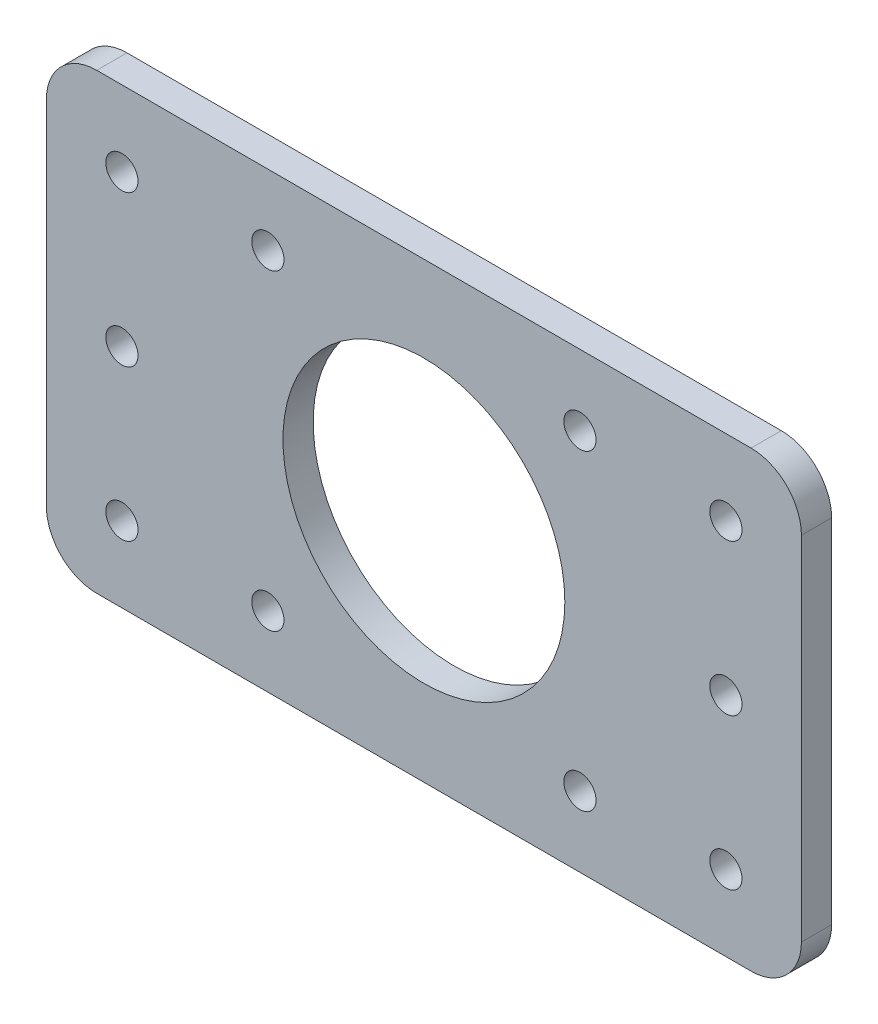
ISO-10303-21;
HEADER;
FILE_DESCRIPTION(('STEP AP214'),'2;1');
FILE_NAME('part.step','',(''),(''),'','','');
FILE_SCHEMA(('AUTOMOTIVE_DESIGN { 1 0 10303 214 1 1 1 1 }'));
ENDSEC;
DATA;
#1=APPLICATION_CONTEXT('core data for automotive mechanical design processes');
#2=APPLICATION_PROTOCOL_DEFINITION('international standard','automotive_design',2000,#1);
#3=PRODUCT_CONTEXT('',#1,'mechanical');
#4=PRODUCT('Part','Part','',(#3));
#5=PRODUCT_RELATED_PRODUCT_CATEGORY('part','',(#4));
#6=PRODUCT_DEFINITION_FORMATION('','',#4);
#7=PRODUCT_DEFINITION_CONTEXT('part definition',#1,'design');
#8=PRODUCT_DEFINITION('design','',#6,#7);
#9=PRODUCT_DEFINITION_SHAPE('','',#8);
#10=(LENGTH_UNIT() NAMED_UNIT(*) SI_UNIT(.MILLI.,.METRE.));
#11=(NAMED_UNIT(*) PLANE_ANGLE_UNIT() SI_UNIT($,.RADIAN.));
#12=(NAMED_UNIT(*) SI_UNIT($,.STERADIAN.) SOLID_ANGLE_UNIT());
#13=UNCERTAINTY_MEASURE_WITH_UNIT(LENGTH_MEASURE(1.E-05),#10,'distance_accuracy_value','');
#14=(GEOMETRIC_REPRESENTATION_CONTEXT(3) GLOBAL_UNCERTAINTY_ASSIGNED_CONTEXT((#13)) GLOBAL_UNIT_ASSIGNED_CONTEXT((#10,
#11,#12)) REPRESENTATION_CONTEXT('',''));
#15=CARTESIAN_POINT('',(0.,0.,0.));
#16=DIRECTION('',(0.,0.,1.));
#17=DIRECTION('',(1.,0.,0.));
#18=AXIS2_PLACEMENT_3D('',#15,#16,#17);
#19=CARTESIAN_POINT('',(0.,0.,3.));
#20=DIRECTION('',(0.,0.,-1.));
#21=DIRECTION('',(-1.,0.,0.));
#22=AXIS2_PLACEMENT_3D('',#19,#20,#21);
#23=PLANE('',#22);
#24=CARTESIAN_POINT('',(30.,0.,3.));
#25=DIRECTION('',(0.,0.,1.));
#26=DIRECTION('',(-1.,0.,0.));
#27=AXIS2_PLACEMENT_3D('',#24,#25,#26);
#28=CIRCLE('',#27,1.60000000000001);
#29=CARTESIAN_POINT('',(28.4,0.,3.));
#30=VERTEX_POINT('',#29);
#31=EDGE_CURVE('E239',#30,#30,#28,.T.);
#32=ORIENTED_EDGE('',*,*,#31,.F.);
#33=EDGE_LOOP('',(#32));
#34=FACE_BOUND('',#33,.T.);
#35=CARTESIAN_POINT('',(30.,15.,3.));
#36=DIRECTION('',(0.,0.,1.));
#37=DIRECTION('',(-1.,0.,0.));
#38=AXIS2_PLACEMENT_3D('',#35,#36,#37);
#39=CIRCLE('',#38,1.6);
#40=CARTESIAN_POINT('',(28.4,15.,3.));
#41=VERTEX_POINT('',#40);
#42=EDGE_CURVE('E233',#41,#41,#39,.T.);
#43=ORIENTED_EDGE('',*,*,#42,.F.);
#44=EDGE_LOOP('',(#43));
#45=FACE_BOUND('',#44,.T.);
#46=CARTESIAN_POINT('',(30.,-15.,3.));
#47=DIRECTION('',(0.,0.,1.));
#48=DIRECTION('',(1.,0.,0.));
#49=AXIS2_PLACEMENT_3D('',#46,#47,#48);
#50=CIRCLE('',#49,1.60000000000001);
#51=CARTESIAN_POINT('',(31.6,-15.,3.));
#52=VERTEX_POINT('',#51);
#53=EDGE_CURVE('E227',#52,#52,#50,.T.);
#54=ORIENTED_EDGE('',*,*,#53,.F.);
#55=EDGE_LOOP('',(#54));
#56=FACE_BOUND('',#55,.T.);
#57=CARTESIAN_POINT('',(-30.,-15.,3.));
#58=DIRECTION('',(0.,0.,1.));
#59=DIRECTION('',(-1.,0.,0.));
#60=AXIS2_PLACEMENT_3D('',#57,#58,#59);
#61=CIRCLE('',#60,1.6);
#62=CARTESIAN_POINT('',(-31.6,-15.,3.));
#63=VERTEX_POINT('',#62);
#64=EDGE_CURVE('E221',#63,#63,#61,.T.);
#65=ORIENTED_EDGE('',*,*,#64,.F.);
#66=EDGE_LOOP('',(#65));
#67=FACE_BOUND('',#66,.T.);
#68=CARTESIAN_POINT('',(-30.,15.,3.));
#69=DIRECTION('',(0.,0.,1.));
#70=DIRECTION('',(1.,0.,0.));
#71=AXIS2_PLACEMENT_3D('',#68,#69,#70);
#72=CIRCLE('',#71,1.6);
#73=CARTESIAN_POINT('',(-28.4,15.,3.));
#74=VERTEX_POINT('',#73);
#75=EDGE_CURVE('E215',#74,#74,#72,.T.);
#76=ORIENTED_EDGE('',*,*,#75,.F.);
#77=EDGE_LOOP('',(#76));
#78=FACE_BOUND('',#77,.T.);
#79=CARTESIAN_POINT('',(-30.,0.,3.));
#80=DIRECTION('',(0.,0.,1.));
#81=DIRECTION('',(1.,0.,0.));
#82=AXIS2_PLACEMENT_3D('',#79,#80,#81);
#83=CIRCLE('',#82,1.60000000000001);
#84=CARTESIAN_POINT('',(-28.4,0.,3.));
#85=VERTEX_POINT('',#84);
#86=EDGE_CURVE('E209',#85,#85,#83,.T.);
#87=ORIENTED_EDGE('',*,*,#86,.F.);
#88=EDGE_LOOP('',(#87));
#89=FACE_BOUND('',#88,.T.);
#90=CARTESIAN_POINT('',(15.5,-15.5,3.));
#91=DIRECTION('',(0.,0.,1.));
#92=DIRECTION('',(1.,0.,0.));
#93=AXIS2_PLACEMENT_3D('',#90,#91,#92);
#94=CIRCLE('',#93,1.6);
#95=CARTESIAN_POINT('',(17.1,-15.5,3.));
#96=VERTEX_POINT('',#95);
#97=EDGE_CURVE('E194',#96,#96,#94,.T.);
#98=ORIENTED_EDGE('',*,*,#97,.F.);
#99=EDGE_LOOP('',(#98));
#100=FACE_BOUND('',#99,.T.);
#101=CARTESIAN_POINT('',(-15.5,15.5,3.));
#102=DIRECTION('',(0.,0.,1.));
#103=DIRECTION('',(1.,0.,0.));
#104=AXIS2_PLACEMENT_3D('',#101,#102,#103);
#105=CIRCLE('',#104,1.6);
#106=CARTESIAN_POINT('',(-13.9,15.5,3.));
#107=VERTEX_POINT('',#106);
#108=EDGE_CURVE('E182',#107,#107,#105,.T.);
#109=ORIENTED_EDGE('',*,*,#108,.F.);
#110=EDGE_LOOP('',(#109));
#111=FACE_BOUND('',#110,.T.);
#112=DIRECTION('',(0.,1.,0.));
#113=VECTOR('',#112,1.);
#114=CARTESIAN_POINT('',(37.5,-22.5,3.));
#115=LINE('',#114,#113);
#116=CARTESIAN_POINT('',(37.5,-17.5,3.));
#117=VERTEX_POINT('',#116);
#118=CARTESIAN_POINT('',(37.5,17.5,3.));
#119=VERTEX_POINT('',#118);
#120=EDGE_CURVE('E139',#117,#119,#115,.T.);
#121=ORIENTED_EDGE('',*,*,#120,.T.);
#122=CARTESIAN_POINT('',(32.5,17.5,3.));
#123=DIRECTION('',(0.,0.,-1.));
#124=DIRECTION('',(-1.,0.,0.));
#125=AXIS2_PLACEMENT_3D('',#122,#123,#124);
#126=CIRCLE('',#125,5.);
#127=CARTESIAN_POINT('',(32.5,22.5,3.));
#128=VERTEX_POINT('',#127);
#129=EDGE_CURVE('E154',#119,#128,#126,.F.);
#130=ORIENTED_EDGE('',*,*,#129,.T.);
#131=DIRECTION('',(-1.,0.,0.));
#132=VECTOR('',#131,1.);
#133=CARTESIAN_POINT('',(-37.5,22.5,3.));
#134=LINE('',#133,#132);
#135=CARTESIAN_POINT('',(-32.5,22.5,3.));
#136=VERTEX_POINT('',#135);
#137=EDGE_CURVE('E121',#128,#136,#134,.T.);
#138=ORIENTED_EDGE('',*,*,#137,.T.);
#139=CARTESIAN_POINT('',(-32.5,17.5,3.));
#140=DIRECTION('',(0.,0.,-1.));
#141=DIRECTION('',(-1.,0.,0.));
#142=AXIS2_PLACEMENT_3D('',#139,#140,#141);
#143=CIRCLE('',#142,5.);
#144=CARTESIAN_POINT('',(-37.5,17.5,3.));
#145=VERTEX_POINT('',#144);
#146=EDGE_CURVE('E149',#136,#145,#143,.F.);
#147=ORIENTED_EDGE('',*,*,#146,.T.);
#148=DIRECTION('',(0.,-1.,0.));
#149=VECTOR('',#148,1.);
#150=CARTESIAN_POINT('',(-37.5,-22.5,3.));
#151=LINE('',#150,#149);
#152=CARTESIAN_POINT('',(-37.5,-17.5,3.));
#153=VERTEX_POINT('',#152);
#154=EDGE_CURVE('E165',#145,#153,#151,.T.);
#155=ORIENTED_EDGE('',*,*,#154,.T.);
#156=CARTESIAN_POINT('',(-32.5,-17.5,3.));
#157=DIRECTION('',(0.,0.,-1.));
#158=DIRECTION('',(-1.,0.,0.));
#159=AXIS2_PLACEMENT_3D('',#156,#157,#158);
#160=CIRCLE('',#159,5.);
#161=CARTESIAN_POINT('',(-32.5,-22.5,3.));
#162=VERTEX_POINT('',#161);
#163=EDGE_CURVE('E57',#153,#162,#160,.F.);
#164=ORIENTED_EDGE('',*,*,#163,.T.);
#165=DIRECTION('',(1.,0.,0.));
#166=VECTOR('',#165,1.);
#167=CARTESIAN_POINT('',(-37.5,-22.5,3.));
#168=LINE('',#167,#166);
#169=CARTESIAN_POINT('',(32.5,-22.5,3.));
#170=VERTEX_POINT('',#169);
#171=EDGE_CURVE('E140',#162,#170,#168,.T.);
#172=ORIENTED_EDGE('',*,*,#171,.T.);
#173=CARTESIAN_POINT('',(32.5,-17.5,3.));
#174=DIRECTION('',(0.,0.,-1.));
#175=DIRECTION('',(-1.,0.,0.));
#176=AXIS2_PLACEMENT_3D('',#173,#174,#175);
#177=CIRCLE('',#176,5.);
#178=EDGE_CURVE('E152',#170,#117,#177,.F.);
#179=ORIENTED_EDGE('',*,*,#178,.T.);
#180=EDGE_LOOP('',(#121,#130,#138,#147,#155,#164,#172,#179));
#181=FACE_BOUND('',#180,.T.);
#182=CARTESIAN_POINT('',(0.,0.,3.));
#183=DIRECTION('',(0.,0.,1.));
#184=DIRECTION('',(1.,0.,0.));
#185=AXIS2_PLACEMENT_3D('',#182,#183,#184);
#186=CIRCLE('',#185,14.);
#187=CARTESIAN_POINT('',(14.,0.,3.));
#188=VERTEX_POINT('',#187);
#189=EDGE_CURVE('E134',#188,#188,#186,.T.);
#190=ORIENTED_EDGE('',*,*,#189,.F.);
#191=EDGE_LOOP('',(#190));
#192=FACE_BOUND('',#191,.T.);
#193=CARTESIAN_POINT('',(15.5,15.5,3.));
#194=DIRECTION('',(0.,0.,1.));
#195=DIRECTION('',(1.,0.,0.));
#196=AXIS2_PLACEMENT_3D('',#193,#194,#195);
#197=CIRCLE('',#196,1.6);
#198=CARTESIAN_POINT('',(17.1,15.5,3.));
#199=VERTEX_POINT('',#198);
#200=EDGE_CURVE('E188',#199,#199,#197,.T.);
#201=ORIENTED_EDGE('',*,*,#200,.F.);
#202=EDGE_LOOP('',(#201));
#203=FACE_BOUND('',#202,.T.);
#204=CARTESIAN_POINT('',(-15.5,-15.5,3.));
#205=DIRECTION('',(0.,0.,1.));
#206=DIRECTION('',(1.,0.,0.));
#207=AXIS2_PLACEMENT_3D('',#204,#205,#206);
#208=CIRCLE('',#207,1.6);
#209=CARTESIAN_POINT('',(-13.9,-15.5,3.));
#210=VERTEX_POINT('',#209);
#211=EDGE_CURVE('E200',#210,#210,#208,.T.);
#212=ORIENTED_EDGE('',*,*,#211,.F.);
#213=EDGE_LOOP('',(#212));
#214=FACE_BOUND('',#213,.T.);
#215=ADVANCED_FACE('F35',(#34,#45,#56,#67,#78,#89,#100,#111,#181,#192,#203,#214),#23,.F.);
#216=CARTESIAN_POINT('',(0.,0.,0.));
#217=DIRECTION('',(0.,0.,-1.));
#218=DIRECTION('',(-1.,0.,0.));
#219=AXIS2_PLACEMENT_3D('',#216,#217,#218);
#220=PLANE('',#219);
#221=CARTESIAN_POINT('',(30.,0.,0.));
#222=DIRECTION('',(0.,0.,1.));
#223=DIRECTION('',(-1.,0.,0.));
#224=AXIS2_PLACEMENT_3D('',#221,#222,#223);
#225=CIRCLE('',#224,1.60000000000001);
#226=CARTESIAN_POINT('',(28.4,0.,0.));
#227=VERTEX_POINT('',#226);
#228=EDGE_CURVE('E236',#227,#227,#225,.T.);
#229=ORIENTED_EDGE('',*,*,#228,.T.);
#230=EDGE_LOOP('',(#229));
#231=FACE_BOUND('',#230,.T.);
#232=CARTESIAN_POINT('',(30.,15.,0.));
#233=DIRECTION('',(0.,0.,1.));
#234=DIRECTION('',(-1.,0.,0.));
#235=AXIS2_PLACEMENT_3D('',#232,#233,#234);
#236=CIRCLE('',#235,1.6);
#237=CARTESIAN_POINT('',(28.4,15.,0.));
#238=VERTEX_POINT('',#237);
#239=EDGE_CURVE('E230',#238,#238,#236,.T.);
#240=ORIENTED_EDGE('',*,*,#239,.T.);
#241=EDGE_LOOP('',(#240));
#242=FACE_BOUND('',#241,.T.);
#243=CARTESIAN_POINT('',(30.,-15.,0.));
#244=DIRECTION('',(0.,0.,1.));
#245=DIRECTION('',(1.,0.,0.));
#246=AXIS2_PLACEMENT_3D('',#243,#244,#245);
#247=CIRCLE('',#246,1.60000000000001);
#248=CARTESIAN_POINT('',(31.6,-15.,0.));
#249=VERTEX_POINT('',#248);
#250=EDGE_CURVE('E224',#249,#249,#247,.T.);
#251=ORIENTED_EDGE('',*,*,#250,.T.);
#252=EDGE_LOOP('',(#251));
#253=FACE_BOUND('',#252,.T.);
#254=CARTESIAN_POINT('',(-30.,-15.,0.));
#255=DIRECTION('',(0.,0.,1.));
#256=DIRECTION('',(-1.,0.,0.));
#257=AXIS2_PLACEMENT_3D('',#254,#255,#256);
#258=CIRCLE('',#257,1.6);
#259=CARTESIAN_POINT('',(-31.6,-15.,0.));
#260=VERTEX_POINT('',#259);
#261=EDGE_CURVE('E218',#260,#260,#258,.T.);
#262=ORIENTED_EDGE('',*,*,#261,.T.);
#263=EDGE_LOOP('',(#262));
#264=FACE_BOUND('',#263,.T.);
#265=CARTESIAN_POINT('',(-30.,15.,0.));
#266=DIRECTION('',(0.,0.,1.));
#267=DIRECTION('',(1.,0.,0.));
#268=AXIS2_PLACEMENT_3D('',#265,#266,#267);
#269=CIRCLE('',#268,1.6);
#270=CARTESIAN_POINT('',(-28.4,15.,0.));
#271=VERTEX_POINT('',#270);
#272=EDGE_CURVE('E212',#271,#271,#269,.T.);
#273=ORIENTED_EDGE('',*,*,#272,.T.);
#274=EDGE_LOOP('',(#273));
#275=FACE_BOUND('',#274,.T.);
#276=CARTESIAN_POINT('',(-30.,0.,0.));
#277=DIRECTION('',(0.,0.,1.));
#278=DIRECTION('',(1.,0.,0.));
#279=AXIS2_PLACEMENT_3D('',#276,#277,#278);
#280=CIRCLE('',#279,1.60000000000001);
#281=CARTESIAN_POINT('',(-28.4,0.,0.));
#282=VERTEX_POINT('',#281);
#283=EDGE_CURVE('E206',#282,#282,#280,.T.);
#284=ORIENTED_EDGE('',*,*,#283,.T.);
#285=EDGE_LOOP('',(#284));
#286=FACE_BOUND('',#285,.T.);
#287=CARTESIAN_POINT('',(15.5,-15.5,0.));
#288=DIRECTION('',(0.,0.,1.));
#289=DIRECTION('',(1.,0.,0.));
#290=AXIS2_PLACEMENT_3D('',#287,#288,#289);
#291=CIRCLE('',#290,1.6);
#292=CARTESIAN_POINT('',(17.1,-15.5,0.));
#293=VERTEX_POINT('',#292);
#294=EDGE_CURVE('E197',#293,#293,#291,.T.);
#295=ORIENTED_EDGE('',*,*,#294,.T.);
#296=EDGE_LOOP('',(#295));
#297=FACE_BOUND('',#296,.T.);
#298=CARTESIAN_POINT('',(-15.5,15.5,0.));
#299=DIRECTION('',(0.,0.,1.));
#300=DIRECTION('',(1.,0.,0.));
#301=AXIS2_PLACEMENT_3D('',#298,#299,#300);
#302=CIRCLE('',#301,1.6);
#303=CARTESIAN_POINT('',(-13.9,15.5,0.));
#304=VERTEX_POINT('',#303);
#305=EDGE_CURVE('E185',#304,#304,#302,.T.);
#306=ORIENTED_EDGE('',*,*,#305,.T.);
#307=EDGE_LOOP('',(#306));
#308=FACE_BOUND('',#307,.T.);
#309=DIRECTION('',(-1.,0.,0.));
#310=VECTOR('',#309,1.);
#311=CARTESIAN_POINT('',(-37.5,22.5,0.));
#312=LINE('',#311,#310);
#313=CARTESIAN_POINT('',(32.5,22.5,0.));
#314=VERTEX_POINT('',#313);
#315=CARTESIAN_POINT('',(-32.5,22.5,0.));
#316=VERTEX_POINT('',#315);
#317=EDGE_CURVE('E118',#314,#316,#312,.T.);
#318=ORIENTED_EDGE('',*,*,#317,.F.);
#319=CARTESIAN_POINT('',(32.5,17.5,0.));
#320=DIRECTION('',(0.,0.,-1.));
#321=DIRECTION('',(-1.,0.,0.));
#322=AXIS2_PLACEMENT_3D('',#319,#320,#321);
#323=CIRCLE('',#322,5.);
#324=CARTESIAN_POINT('',(37.5,17.5,0.));
#325=VERTEX_POINT('',#324);
#326=EDGE_CURVE('E101',#314,#325,#323,.T.);
#327=ORIENTED_EDGE('',*,*,#326,.T.);
#328=DIRECTION('',(0.,1.,0.));
#329=VECTOR('',#328,1.);
#330=CARTESIAN_POINT('',(37.5,-22.5,0.));
#331=LINE('',#330,#329);
#332=CARTESIAN_POINT('',(37.5,-17.5,0.));
#333=VERTEX_POINT('',#332);
#334=EDGE_CURVE('E129',#333,#325,#331,.T.);
#335=ORIENTED_EDGE('',*,*,#334,.F.);
#336=CARTESIAN_POINT('',(32.5,-17.5,0.));
#337=DIRECTION('',(0.,0.,-1.));
#338=DIRECTION('',(-1.,0.,0.));
#339=AXIS2_PLACEMENT_3D('',#336,#337,#338);
#340=CIRCLE('',#339,5.);
#341=CARTESIAN_POINT('',(32.5,-22.5,0.));
#342=VERTEX_POINT('',#341);
#343=EDGE_CURVE('E112',#333,#342,#340,.T.);
#344=ORIENTED_EDGE('',*,*,#343,.T.);
#345=DIRECTION('',(1.,0.,0.));
#346=VECTOR('',#345,1.);
#347=CARTESIAN_POINT('',(-37.5,-22.5,0.));
#348=LINE('',#347,#346);
#349=CARTESIAN_POINT('',(-32.5,-22.5,0.));
#350=VERTEX_POINT('',#349);
#351=EDGE_CURVE('E132',#350,#342,#348,.T.);
#352=ORIENTED_EDGE('',*,*,#351,.F.);
#353=CARTESIAN_POINT('',(-32.5,-17.5,0.));
#354=DIRECTION('',(0.,0.,-1.));
#355=DIRECTION('',(-1.,0.,0.));
#356=AXIS2_PLACEMENT_3D('',#353,#354,#355);
#357=CIRCLE('',#356,5.);
#358=CARTESIAN_POINT('',(-37.5,-17.5,0.));
#359=VERTEX_POINT('',#358);
#360=EDGE_CURVE('E143',#350,#359,#357,.T.);
#361=ORIENTED_EDGE('',*,*,#360,.T.);
#362=DIRECTION('',(0.,-1.,0.));
#363=VECTOR('',#362,1.);
#364=CARTESIAN_POINT('',(-37.5,-22.5,0.));
#365=LINE('',#364,#363);
#366=CARTESIAN_POINT('',(-37.5,17.5,0.));
#367=VERTEX_POINT('',#366);
#368=EDGE_CURVE('E128',#367,#359,#365,.T.);
#369=ORIENTED_EDGE('',*,*,#368,.F.);
#370=CARTESIAN_POINT('',(-32.5,17.5,0.));
#371=DIRECTION('',(0.,0.,-1.));
#372=DIRECTION('',(-1.,0.,0.));
#373=AXIS2_PLACEMENT_3D('',#370,#371,#372);
#374=CIRCLE('',#373,5.);
#375=EDGE_CURVE('E122',#367,#316,#374,.T.);
#376=ORIENTED_EDGE('',*,*,#375,.T.);
#377=EDGE_LOOP('',(#318,#327,#335,#344,#352,#361,#369,#376));
#378=FACE_BOUND('',#377,.T.);
#379=CARTESIAN_POINT('',(0.,0.,0.));
#380=DIRECTION('',(0.,0.,1.));
#381=DIRECTION('',(1.,0.,0.));
#382=AXIS2_PLACEMENT_3D('',#379,#380,#381);
#383=CIRCLE('',#382,14.);
#384=CARTESIAN_POINT('',(14.,0.,0.));
#385=VERTEX_POINT('',#384);
#386=EDGE_CURVE('E179',#385,#385,#383,.T.);
#387=ORIENTED_EDGE('',*,*,#386,.T.);
#388=EDGE_LOOP('',(#387));
#389=FACE_BOUND('',#388,.T.);
#390=CARTESIAN_POINT('',(15.5,15.5,0.));
#391=DIRECTION('',(0.,0.,1.));
#392=DIRECTION('',(1.,0.,0.));
#393=AXIS2_PLACEMENT_3D('',#390,#391,#392);
#394=CIRCLE('',#393,1.6);
#395=CARTESIAN_POINT('',(17.1,15.5,0.));
#396=VERTEX_POINT('',#395);
#397=EDGE_CURVE('E191',#396,#396,#394,.T.);
#398=ORIENTED_EDGE('',*,*,#397,.T.);
#399=EDGE_LOOP('',(#398));
#400=FACE_BOUND('',#399,.T.);
#401=CARTESIAN_POINT('',(-15.5,-15.5,0.));
#402=DIRECTION('',(0.,0.,1.));
#403=DIRECTION('',(1.,0.,0.));
#404=AXIS2_PLACEMENT_3D('',#401,#402,#403);
#405=CIRCLE('',#404,1.6);
#406=CARTESIAN_POINT('',(-13.9,-15.5,0.));
#407=VERTEX_POINT('',#406);
#408=EDGE_CURVE('E203',#407,#407,#405,.T.);
#409=ORIENTED_EDGE('',*,*,#408,.T.);
#410=EDGE_LOOP('',(#409));
#411=FACE_BOUND('',#410,.T.);
#412=ADVANCED_FACE('F125',(#231,#242,#253,#264,#275,#286,#297,#308,#378,#389,#400,#411),#220,.T.);
#413=CARTESIAN_POINT('',(37.5,-22.5,3.));
#414=DIRECTION('',(-1.,0.,0.));
#415=DIRECTION('',(0.,0.,1.));
#416=AXIS2_PLACEMENT_3D('',#413,#414,#415);
#417=PLANE('',#416);
#418=ORIENTED_EDGE('',*,*,#334,.T.);
#419=DIRECTION('',(0.,0.,-1.));
#420=VECTOR('',#419,1.);
#421=CARTESIAN_POINT('',(37.5,17.5,3.));
#422=LINE('',#421,#420);
#423=EDGE_CURVE('E106',#325,#119,#422,.F.);
#424=ORIENTED_EDGE('',*,*,#423,.T.);
#425=ORIENTED_EDGE('',*,*,#120,.F.);
#426=DIRECTION('',(0.,0.,-1.));
#427=VECTOR('',#426,1.);
#428=CARTESIAN_POINT('',(37.5,-17.5,3.));
#429=LINE('',#428,#427);
#430=EDGE_CURVE('E111',#117,#333,#429,.T.);
#431=ORIENTED_EDGE('',*,*,#430,.T.);
#432=EDGE_LOOP('',(#418,#424,#425,#431));
#433=FACE_BOUND('',#432,.T.);
#434=ADVANCED_FACE('F286',(#433),#417,.F.);
#435=CARTESIAN_POINT('',(-37.5,22.5,3.));
#436=DIRECTION('',(0.,-1.,0.));
#437=DIRECTION('',(0.,0.,-1.));
#438=AXIS2_PLACEMENT_3D('',#435,#436,#437);
#439=PLANE('',#438);
#440=ORIENTED_EDGE('',*,*,#137,.F.);
#441=DIRECTION('',(0.,0.,-1.));
#442=VECTOR('',#441,1.);
#443=CARTESIAN_POINT('',(32.5,22.5,3.));
#444=LINE('',#443,#442);
#445=EDGE_CURVE('E105',#128,#314,#444,.T.);
#446=ORIENTED_EDGE('',*,*,#445,.T.);
#447=ORIENTED_EDGE('',*,*,#317,.T.);
#448=DIRECTION('',(0.,0.,-1.));
#449=VECTOR('',#448,1.);
#450=CARTESIAN_POINT('',(-32.5,22.5,3.));
#451=LINE('',#450,#449);
#452=EDGE_CURVE('E123',#316,#136,#451,.F.);
#453=ORIENTED_EDGE('',*,*,#452,.T.);
#454=EDGE_LOOP('',(#440,#446,#447,#453));
#455=FACE_BOUND('',#454,.T.);
#456=ADVANCED_FACE('F117',(#455),#439,.F.);
#457=CARTESIAN_POINT('',(-37.5,-22.5,3.));
#458=DIRECTION('',(1.,0.,0.));
#459=DIRECTION('',(0.,0.,-1.));
#460=AXIS2_PLACEMENT_3D('',#457,#458,#459);
#461=PLANE('',#460);
#462=ORIENTED_EDGE('',*,*,#368,.T.);
#463=DIRECTION('',(0.,0.,-1.));
#464=VECTOR('',#463,1.);
#465=CARTESIAN_POINT('',(-37.5,-17.5,3.));
#466=LINE('',#465,#464);
#467=EDGE_CURVE('E11',#359,#153,#466,.F.);
#468=ORIENTED_EDGE('',*,*,#467,.T.);
#469=ORIENTED_EDGE('',*,*,#154,.F.);
#470=DIRECTION('',(0.,0.,-1.));
#471=VECTOR('',#470,1.);
#472=CARTESIAN_POINT('',(-37.5,17.5,3.));
#473=LINE('',#472,#471);
#474=EDGE_CURVE('E43',#145,#367,#473,.T.);
#475=ORIENTED_EDGE('',*,*,#474,.T.);
#476=EDGE_LOOP('',(#462,#468,#469,#475));
#477=FACE_BOUND('',#476,.T.);
#478=ADVANCED_FACE('F163',(#477),#461,.F.);
#479=CARTESIAN_POINT('',(-37.5,-22.5,3.));
#480=DIRECTION('',(0.,1.,0.));
#481=DIRECTION('',(0.,0.,1.));
#482=AXIS2_PLACEMENT_3D('',#479,#480,#481);
#483=PLANE('',#482);
#484=ORIENTED_EDGE('',*,*,#351,.T.);
#485=DIRECTION('',(0.,0.,-1.));
#486=VECTOR('',#485,1.);
#487=CARTESIAN_POINT('',(32.5,-22.5,3.));
#488=LINE('',#487,#486);
#489=EDGE_CURVE('E50',#342,#170,#488,.F.);
#490=ORIENTED_EDGE('',*,*,#489,.T.);
#491=ORIENTED_EDGE('',*,*,#171,.F.);
#492=DIRECTION('',(0.,0.,-1.));
#493=VECTOR('',#492,1.);
#494=CARTESIAN_POINT('',(-32.5,-22.5,3.));
#495=LINE('',#494,#493);
#496=EDGE_CURVE('E156',#162,#350,#495,.T.);
#497=ORIENTED_EDGE('',*,*,#496,.T.);
#498=EDGE_LOOP('',(#484,#490,#491,#497));
#499=FACE_BOUND('',#498,.T.);
#500=ADVANCED_FACE('F172',(#499),#483,.F.);
#501=CARTESIAN_POINT('',(0.,0.,3.));
#502=DIRECTION('',(0.,0.,-1.));
#503=DIRECTION('',(-1.,0.,0.));
#504=AXIS2_PLACEMENT_3D('',#501,#502,#503);
#505=CYLINDRICAL_SURFACE('',#504,14.);
#506=ORIENTED_EDGE('',*,*,#189,.T.);
#507=EDGE_LOOP('',(#506));
#508=FACE_BOUND('',#507,.T.);
#509=ORIENTED_EDGE('',*,*,#386,.F.);
#510=EDGE_LOOP('',(#509));
#511=FACE_BOUND('',#510,.T.);
#512=ADVANCED_FACE('F297',(#508,#511),#505,.F.);
#513=CARTESIAN_POINT('',(-15.5,15.5,3.));
#514=DIRECTION('',(0.,0.,-1.));
#515=DIRECTION('',(-1.,0.,0.));
#516=AXIS2_PLACEMENT_3D('',#513,#514,#515);
#517=CYLINDRICAL_SURFACE('',#516,1.6);
#518=ORIENTED_EDGE('',*,*,#108,.T.);
#519=EDGE_LOOP('',(#518));
#520=FACE_BOUND('',#519,.T.);
#521=ORIENTED_EDGE('',*,*,#305,.F.);
#522=EDGE_LOOP('',(#521));
#523=FACE_BOUND('',#522,.T.);
#524=ADVANCED_FACE('F334',(#520,#523),#517,.F.);
#525=CARTESIAN_POINT('',(15.5,15.5,3.));
#526=DIRECTION('',(0.,0.,-1.));
#527=DIRECTION('',(-1.,0.,0.));
#528=AXIS2_PLACEMENT_3D('',#525,#526,#527);
#529=CYLINDRICAL_SURFACE('',#528,1.6);
#530=ORIENTED_EDGE('',*,*,#200,.T.);
#531=EDGE_LOOP('',(#530));
#532=FACE_BOUND('',#531,.T.);
#533=ORIENTED_EDGE('',*,*,#397,.F.);
#534=EDGE_LOOP('',(#533));
#535=FACE_BOUND('',#534,.T.);
#536=ADVANCED_FACE('F330',(#532,#535),#529,.F.);
#537=CARTESIAN_POINT('',(15.5,-15.5,3.));
#538=DIRECTION('',(0.,0.,-1.));
#539=DIRECTION('',(-1.,0.,0.));
#540=AXIS2_PLACEMENT_3D('',#537,#538,#539);
#541=CYLINDRICAL_SURFACE('',#540,1.6);
#542=ORIENTED_EDGE('',*,*,#97,.T.);
#543=EDGE_LOOP('',(#542));
#544=FACE_BOUND('',#543,.T.);
#545=ORIENTED_EDGE('',*,*,#294,.F.);
#546=EDGE_LOOP('',(#545));
#547=FACE_BOUND('',#546,.T.);
#548=ADVANCED_FACE('F281',(#544,#547),#541,.F.);
#549=CARTESIAN_POINT('',(-15.5,-15.5,3.));
#550=DIRECTION('',(0.,0.,-1.));
#551=DIRECTION('',(-1.,0.,0.));
#552=AXIS2_PLACEMENT_3D('',#549,#550,#551);
#553=CYLINDRICAL_SURFACE('',#552,1.6);
#554=ORIENTED_EDGE('',*,*,#211,.T.);
#555=EDGE_LOOP('',(#554));
#556=FACE_BOUND('',#555,.T.);
#557=ORIENTED_EDGE('',*,*,#408,.F.);
#558=EDGE_LOOP('',(#557));
#559=FACE_BOUND('',#558,.T.);
#560=ADVANCED_FACE('F278',(#556,#559),#553,.F.);
#561=CARTESIAN_POINT('',(32.5,17.5,3.));
#562=DIRECTION('',(0.,0.,-1.));
#563=DIRECTION('',(-1.,0.,0.));
#564=AXIS2_PLACEMENT_3D('',#561,#562,#563);
#565=CYLINDRICAL_SURFACE('',#564,5.);
#566=ORIENTED_EDGE('',*,*,#129,.F.);
#567=ORIENTED_EDGE('',*,*,#423,.F.);
#568=ORIENTED_EDGE('',*,*,#326,.F.);
#569=ORIENTED_EDGE('',*,*,#445,.F.);
#570=EDGE_LOOP('',(#566,#567,#568,#569));
#571=FACE_BOUND('',#570,.T.);
#572=ADVANCED_FACE('F104',(#571),#565,.T.);
#573=CARTESIAN_POINT('',(32.5,-17.5,3.));
#574=DIRECTION('',(0.,0.,-1.));
#575=DIRECTION('',(-1.,0.,0.));
#576=AXIS2_PLACEMENT_3D('',#573,#574,#575);
#577=CYLINDRICAL_SURFACE('',#576,5.);
#578=ORIENTED_EDGE('',*,*,#178,.F.);
#579=ORIENTED_EDGE('',*,*,#489,.F.);
#580=ORIENTED_EDGE('',*,*,#343,.F.);
#581=ORIENTED_EDGE('',*,*,#430,.F.);
#582=EDGE_LOOP('',(#578,#579,#580,#581));
#583=FACE_BOUND('',#582,.T.);
#584=ADVANCED_FACE('F304',(#583),#577,.T.);
#585=CARTESIAN_POINT('',(-32.5,-17.5,3.));
#586=DIRECTION('',(0.,0.,-1.));
#587=DIRECTION('',(-1.,0.,0.));
#588=AXIS2_PLACEMENT_3D('',#585,#586,#587);
#589=CYLINDRICAL_SURFACE('',#588,5.);
#590=ORIENTED_EDGE('',*,*,#163,.F.);
#591=ORIENTED_EDGE('',*,*,#467,.F.);
#592=ORIENTED_EDGE('',*,*,#360,.F.);
#593=ORIENTED_EDGE('',*,*,#496,.F.);
#594=EDGE_LOOP('',(#590,#591,#592,#593));
#595=FACE_BOUND('',#594,.T.);
#596=ADVANCED_FACE('F171',(#595),#589,.T.);
#597=CARTESIAN_POINT('',(-32.5,17.5,3.));
#598=DIRECTION('',(0.,0.,-1.));
#599=DIRECTION('',(-1.,0.,0.));
#600=AXIS2_PLACEMENT_3D('',#597,#598,#599);
#601=CYLINDRICAL_SURFACE('',#600,5.);
#602=ORIENTED_EDGE('',*,*,#146,.F.);
#603=ORIENTED_EDGE('',*,*,#452,.F.);
#604=ORIENTED_EDGE('',*,*,#375,.F.);
#605=ORIENTED_EDGE('',*,*,#474,.F.);
#606=EDGE_LOOP('',(#602,#603,#604,#605));
#607=FACE_BOUND('',#606,.T.);
#608=ADVANCED_FACE('F37',(#607),#601,.T.);
#609=CARTESIAN_POINT('',(-30.,0.,0.));
#610=DIRECTION('',(0.,0.,1.));
#611=DIRECTION('',(1.,0.,0.));
#612=AXIS2_PLACEMENT_3D('',#609,#610,#611);
#613=CYLINDRICAL_SURFACE('',#612,1.60000000000001);
#614=ORIENTED_EDGE('',*,*,#283,.F.);
#615=EDGE_LOOP('',(#614));
#616=FACE_BOUND('',#615,.T.);
#617=ORIENTED_EDGE('',*,*,#86,.T.);
#618=EDGE_LOOP('',(#617));
#619=FACE_BOUND('',#618,.T.);
#620=ADVANCED_FACE('F311',(#616,#619),#613,.F.);
#621=CARTESIAN_POINT('',(-30.,15.,0.));
#622=DIRECTION('',(0.,0.,1.));
#623=DIRECTION('',(1.,0.,0.));
#624=AXIS2_PLACEMENT_3D('',#621,#622,#623);
#625=CYLINDRICAL_SURFACE('',#624,1.6);
#626=ORIENTED_EDGE('',*,*,#272,.F.);
#627=EDGE_LOOP('',(#626));
#628=FACE_BOUND('',#627,.T.);
#629=ORIENTED_EDGE('',*,*,#75,.T.);
#630=EDGE_LOOP('',(#629));
#631=FACE_BOUND('',#630,.T.);
#632=ADVANCED_FACE('F315',(#628,#631),#625,.F.);
#633=CARTESIAN_POINT('',(-30.,-15.,0.));
#634=DIRECTION('',(0.,0.,1.));
#635=DIRECTION('',(1.,0.,0.));
#636=AXIS2_PLACEMENT_3D('',#633,#634,#635);
#637=CYLINDRICAL_SURFACE('',#636,1.6);
#638=ORIENTED_EDGE('',*,*,#261,.F.);
#639=EDGE_LOOP('',(#638));
#640=FACE_BOUND('',#639,.T.);
#641=ORIENTED_EDGE('',*,*,#64,.T.);
#642=EDGE_LOOP('',(#641));
#643=FACE_BOUND('',#642,.T.);
#644=ADVANCED_FACE('F321',(#640,#643),#637,.F.);
#645=CARTESIAN_POINT('',(30.,-15.,0.));
#646=DIRECTION('',(0.,0.,1.));
#647=DIRECTION('',(1.,0.,0.));
#648=AXIS2_PLACEMENT_3D('',#645,#646,#647);
#649=CYLINDRICAL_SURFACE('',#648,1.60000000000001);
#650=ORIENTED_EDGE('',*,*,#250,.F.);
#651=EDGE_LOOP('',(#650));
#652=FACE_BOUND('',#651,.T.);
#653=ORIENTED_EDGE('',*,*,#53,.T.);
#654=EDGE_LOOP('',(#653));
#655=FACE_BOUND('',#654,.T.);
#656=ADVANCED_FACE('F412',(#652,#655),#649,.F.);
#657=CARTESIAN_POINT('',(30.,15.,0.));
#658=DIRECTION('',(0.,0.,1.));
#659=DIRECTION('',(1.,0.,0.));
#660=AXIS2_PLACEMENT_3D('',#657,#658,#659);
#661=CYLINDRICAL_SURFACE('',#660,1.6);
#662=ORIENTED_EDGE('',*,*,#239,.F.);
#663=EDGE_LOOP('',(#662));
#664=FACE_BOUND('',#663,.T.);
#665=ORIENTED_EDGE('',*,*,#42,.T.);
#666=EDGE_LOOP('',(#665));
#667=FACE_BOUND('',#666,.T.);
#668=ADVANCED_FACE('F250',(#664,#667),#661,.F.);
#669=CARTESIAN_POINT('',(30.,0.,0.));
#670=DIRECTION('',(0.,0.,1.));
#671=DIRECTION('',(1.,0.,0.));
#672=AXIS2_PLACEMENT_3D('',#669,#670,#671);
#673=CYLINDRICAL_SURFACE('',#672,1.60000000000001);
#674=ORIENTED_EDGE('',*,*,#228,.F.);
#675=EDGE_LOOP('',(#674));
#676=FACE_BOUND('',#675,.T.);
#677=ORIENTED_EDGE('',*,*,#31,.T.);
#678=EDGE_LOOP('',(#677));
#679=FACE_BOUND('',#678,.T.);
#680=ADVANCED_FACE('F247',(#676,#679),#673,.F.);
#681=CLOSED_SHELL('',(#215,#412,#434,#456,#478,#500,#512,#524,#536,#548,#560,#572,#584,#596,
#608,#620,#632,#644,#656,#668,#680));
#682=MANIFOLD_SOLID_BREP('B2',#681);
#683=ADVANCED_BREP_SHAPE_REPRESENTATION('',(#18,#682),#14);
#684=SHAPE_DEFINITION_REPRESENTATION(#9,#683);
ENDSEC;
END-ISO-10303-21;
